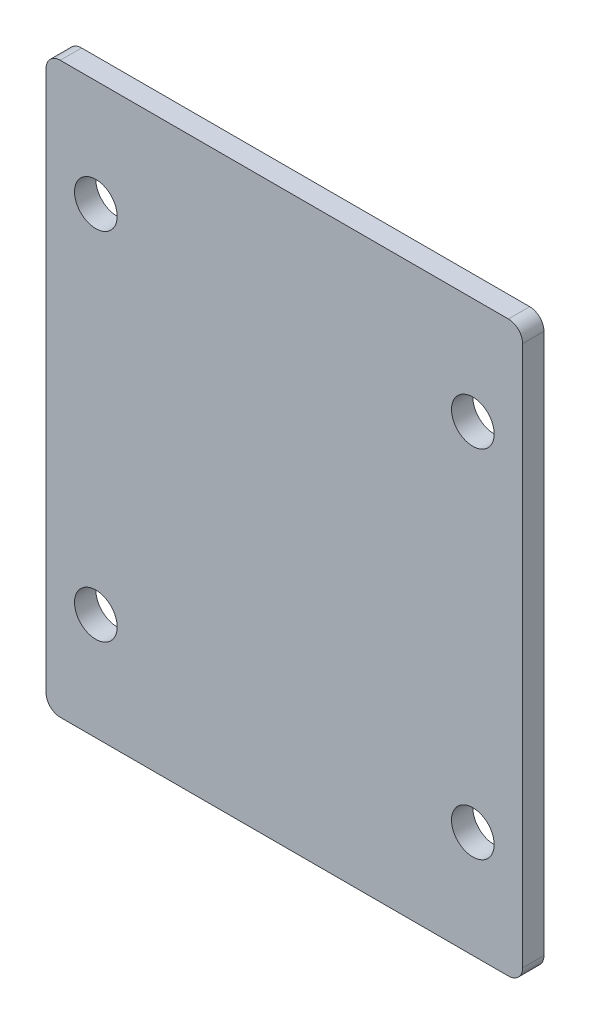
ISO-10303-21;
HEADER;
FILE_DESCRIPTION(('STEP AP214'),'2;1');
FILE_NAME('part.step','',(''),(''),'','','');
FILE_SCHEMA(('AUTOMOTIVE_DESIGN { 1 0 10303 214 1 1 1 1 }'));
ENDSEC;
DATA;
#1=APPLICATION_CONTEXT('core data for automotive mechanical design processes');
#2=APPLICATION_PROTOCOL_DEFINITION('international standard','automotive_design',2000,#1);
#3=PRODUCT_CONTEXT('',#1,'mechanical');
#4=PRODUCT('Part','Part','',(#3));
#5=PRODUCT_RELATED_PRODUCT_CATEGORY('part','',(#4));
#6=PRODUCT_DEFINITION_FORMATION('','',#4);
#7=PRODUCT_DEFINITION_CONTEXT('part definition',#1,'design');
#8=PRODUCT_DEFINITION('design','',#6,#7);
#9=PRODUCT_DEFINITION_SHAPE('','',#8);
#10=(LENGTH_UNIT() NAMED_UNIT(*) SI_UNIT(.MILLI.,.METRE.));
#11=(NAMED_UNIT(*) PLANE_ANGLE_UNIT() SI_UNIT($,.RADIAN.));
#12=(NAMED_UNIT(*) SI_UNIT($,.STERADIAN.) SOLID_ANGLE_UNIT());
#13=UNCERTAINTY_MEASURE_WITH_UNIT(LENGTH_MEASURE(1.E-05),#10,'distance_accuracy_value','');
#14=(GEOMETRIC_REPRESENTATION_CONTEXT(3) GLOBAL_UNCERTAINTY_ASSIGNED_CONTEXT((#13)) GLOBAL_UNIT_ASSIGNED_CONTEXT((#10,
#11,#12)) REPRESENTATION_CONTEXT('',''));
#15=CARTESIAN_POINT('',(0.,0.,0.));
#16=DIRECTION('',(0.,0.,1.));
#17=DIRECTION('',(1.,0.,0.));
#18=AXIS2_PLACEMENT_3D('',#15,#16,#17);
#19=CARTESIAN_POINT('',(258.579860694125,180.707229453302,-1.5));
#20=DIRECTION('',(-1.,0.,0.));
#21=DIRECTION('',(0.,0.,1.));
#22=AXIS2_PLACEMENT_3D('',#19,#20,#21);
#23=PLANE('',#22);
#24=DIRECTION('',(0.,-1.,0.));
#25=VECTOR('',#24,1.);
#26=CARTESIAN_POINT('',(258.579860694125,180.707229453302,0.));
#27=LINE('',#26,#25);
#28=CARTESIAN_POINT('',(258.579860694125,219.707229453302,0.));
#29=VERTEX_POINT('',#28);
#30=CARTESIAN_POINT('',(258.579860694125,181.707229453302,0.));
#31=VERTEX_POINT('',#30);
#32=EDGE_CURVE('E110',#29,#31,#27,.T.);
#33=ORIENTED_EDGE('',*,*,#32,.F.);
#34=DIRECTION('',(0.,0.,1.));
#35=VECTOR('',#34,1.);
#36=CARTESIAN_POINT('',(258.579860694125,219.707229453302,-1.5));
#37=LINE('',#36,#35);
#38=CARTESIAN_POINT('',(258.579860694125,219.707229453302,-1.5));
#39=VERTEX_POINT('',#38);
#40=EDGE_CURVE('E11',#29,#39,#37,.F.);
#41=ORIENTED_EDGE('',*,*,#40,.T.);
#42=DIRECTION('',(0.,-1.,0.));
#43=VECTOR('',#42,1.);
#44=CARTESIAN_POINT('',(258.579860694125,180.707229453302,-1.5));
#45=LINE('',#44,#43);
#46=CARTESIAN_POINT('',(258.579860694125,181.707229453302,-1.5));
#47=VERTEX_POINT('',#46);
#48=EDGE_CURVE('E160',#39,#47,#45,.T.);
#49=ORIENTED_EDGE('',*,*,#48,.T.);
#50=DIRECTION('',(0.,0.,1.));
#51=VECTOR('',#50,1.);
#52=CARTESIAN_POINT('',(258.579860694125,181.707229453302,-1.5));
#53=LINE('',#52,#51);
#54=EDGE_CURVE('E47',#47,#31,#53,.T.);
#55=ORIENTED_EDGE('',*,*,#54,.T.);
#56=EDGE_LOOP('',(#33,#41,#49,#55));
#57=FACE_BOUND('',#56,.T.);
#58=ADVANCED_FACE('F39',(#57),#23,.T.);
#59=CARTESIAN_POINT('',(258.579860694125,220.707229453302,-1.5));
#60=DIRECTION('',(0.,1.,0.));
#61=DIRECTION('',(0.,0.,1.));
#62=AXIS2_PLACEMENT_3D('',#59,#60,#61);
#63=PLANE('',#62);
#64=DIRECTION('',(-1.,0.,0.));
#65=VECTOR('',#64,1.);
#66=CARTESIAN_POINT('',(258.579860694125,220.707229453302,0.));
#67=LINE('',#66,#65);
#68=CARTESIAN_POINT('',(291.079860694125,220.707229453302,0.));
#69=VERTEX_POINT('',#68);
#70=CARTESIAN_POINT('',(259.579860694125,220.707229453302,0.));
#71=VERTEX_POINT('',#70);
#72=EDGE_CURVE('E135',#69,#71,#67,.T.);
#73=ORIENTED_EDGE('',*,*,#72,.F.);
#74=DIRECTION('',(0.,0.,1.));
#75=VECTOR('',#74,1.);
#76=CARTESIAN_POINT('',(291.079860694125,220.707229453302,-1.5));
#77=LINE('',#76,#75);
#78=CARTESIAN_POINT('',(291.079860694125,220.707229453302,-1.5));
#79=VERTEX_POINT('',#78);
#80=EDGE_CURVE('E61',#69,#79,#77,.F.);
#81=ORIENTED_EDGE('',*,*,#80,.T.);
#82=DIRECTION('',(-1.,0.,0.));
#83=VECTOR('',#82,1.);
#84=CARTESIAN_POINT('',(258.579860694125,220.707229453302,-1.5));
#85=LINE('',#84,#83);
#86=CARTESIAN_POINT('',(259.579860694125,220.707229453302,-1.5));
#87=VERTEX_POINT('',#86);
#88=EDGE_CURVE('E129',#79,#87,#85,.T.);
#89=ORIENTED_EDGE('',*,*,#88,.T.);
#90=DIRECTION('',(0.,0.,1.));
#91=VECTOR('',#90,1.);
#92=CARTESIAN_POINT('',(259.579860694125,220.707229453302,-1.5));
#93=LINE('',#92,#91);
#94=EDGE_CURVE('E154',#87,#71,#93,.T.);
#95=ORIENTED_EDGE('',*,*,#94,.T.);
#96=EDGE_LOOP('',(#73,#81,#89,#95));
#97=FACE_BOUND('',#96,.T.);
#98=ADVANCED_FACE('F197',(#97),#63,.T.);
#99=CARTESIAN_POINT('',(292.079860694125,180.707229453302,-1.5));
#100=DIRECTION('',(1.,0.,0.));
#101=DIRECTION('',(0.,0.,-1.));
#102=AXIS2_PLACEMENT_3D('',#99,#100,#101);
#103=PLANE('',#102);
#104=DIRECTION('',(0.,1.,0.));
#105=VECTOR('',#104,1.);
#106=CARTESIAN_POINT('',(292.079860694125,180.707229453302,0.));
#107=LINE('',#106,#105);
#108=CARTESIAN_POINT('',(292.079860694125,181.707229453302,0.));
#109=VERTEX_POINT('',#108);
#110=CARTESIAN_POINT('',(292.079860694125,219.707229453302,0.));
#111=VERTEX_POINT('',#110);
#112=EDGE_CURVE('E125',#109,#111,#107,.T.);
#113=ORIENTED_EDGE('',*,*,#112,.F.);
#114=DIRECTION('',(0.,0.,1.));
#115=VECTOR('',#114,1.);
#116=CARTESIAN_POINT('',(292.079860694125,181.707229453302,-1.5));
#117=LINE('',#116,#115);
#118=CARTESIAN_POINT('',(292.079860694125,181.707229453302,-1.5));
#119=VERTEX_POINT('',#118);
#120=EDGE_CURVE('E146',#109,#119,#117,.F.);
#121=ORIENTED_EDGE('',*,*,#120,.T.);
#122=DIRECTION('',(0.,1.,0.));
#123=VECTOR('',#122,1.);
#124=CARTESIAN_POINT('',(292.079860694125,180.707229453302,-1.5));
#125=LINE('',#124,#123);
#126=CARTESIAN_POINT('',(292.079860694125,219.707229453302,-1.5));
#127=VERTEX_POINT('',#126);
#128=EDGE_CURVE('E132',#119,#127,#125,.T.);
#129=ORIENTED_EDGE('',*,*,#128,.T.);
#130=DIRECTION('',(0.,0.,1.));
#131=VECTOR('',#130,1.);
#132=CARTESIAN_POINT('',(292.079860694125,219.707229453302,-1.5));
#133=LINE('',#132,#131);
#134=EDGE_CURVE('E143',#127,#111,#133,.T.);
#135=ORIENTED_EDGE('',*,*,#134,.T.);
#136=EDGE_LOOP('',(#113,#121,#129,#135));
#137=FACE_BOUND('',#136,.T.);
#138=ADVANCED_FACE('F176',(#137),#103,.T.);
#139=CARTESIAN_POINT('',(258.579860694125,180.707229453302,-1.5));
#140=DIRECTION('',(0.,-1.,0.));
#141=DIRECTION('',(0.,0.,-1.));
#142=AXIS2_PLACEMENT_3D('',#139,#140,#141);
#143=PLANE('',#142);
#144=DIRECTION('',(1.,0.,0.));
#145=VECTOR('',#144,1.);
#146=CARTESIAN_POINT('',(258.579860694125,180.707229453302,-1.5));
#147=LINE('',#146,#145);
#148=CARTESIAN_POINT('',(259.579860694125,180.707229453302,-1.5));
#149=VERTEX_POINT('',#148);
#150=CARTESIAN_POINT('',(291.079860694125,180.707229453302,-1.5));
#151=VERTEX_POINT('',#150);
#152=EDGE_CURVE('E161',#149,#151,#147,.T.);
#153=ORIENTED_EDGE('',*,*,#152,.T.);
#154=DIRECTION('',(0.,0.,1.));
#155=VECTOR('',#154,1.);
#156=CARTESIAN_POINT('',(291.079860694125,180.707229453302,-1.5));
#157=LINE('',#156,#155);
#158=CARTESIAN_POINT('',(291.079860694125,180.707229453302,0.));
#159=VERTEX_POINT('',#158);
#160=EDGE_CURVE('E116',#151,#159,#157,.T.);
#161=ORIENTED_EDGE('',*,*,#160,.T.);
#162=DIRECTION('',(1.,0.,0.));
#163=VECTOR('',#162,1.);
#164=CARTESIAN_POINT('',(258.579860694125,180.707229453302,0.));
#165=LINE('',#164,#163);
#166=CARTESIAN_POINT('',(259.579860694125,180.707229453302,0.));
#167=VERTEX_POINT('',#166);
#168=EDGE_CURVE('E108',#167,#159,#165,.T.);
#169=ORIENTED_EDGE('',*,*,#168,.F.);
#170=DIRECTION('',(0.,0.,1.));
#171=VECTOR('',#170,1.);
#172=CARTESIAN_POINT('',(259.579860694125,180.707229453302,-1.5));
#173=LINE('',#172,#171);
#174=EDGE_CURVE('E122',#167,#149,#173,.F.);
#175=ORIENTED_EDGE('',*,*,#174,.T.);
#176=EDGE_LOOP('',(#153,#161,#169,#175));
#177=FACE_BOUND('',#176,.T.);
#178=ADVANCED_FACE('F121',(#177),#143,.T.);
#179=CARTESIAN_POINT('',(0.,0.,-1.5));
#180=DIRECTION('',(0.,0.,-1.));
#181=DIRECTION('',(-1.,0.,0.));
#182=AXIS2_PLACEMENT_3D('',#179,#180,#181);
#183=PLANE('',#182);
#184=CARTESIAN_POINT('',(262.079860694125,188.207229453302,-1.5));
#185=DIRECTION('',(0.,0.,1.));
#186=DIRECTION('',(1.,0.,0.));
#187=AXIS2_PLACEMENT_3D('',#184,#185,#186);
#188=CIRCLE('',#187,1.50000000000002);
#189=CARTESIAN_POINT('',(263.579860694125,188.207229453302,-1.5));
#190=VERTEX_POINT('',#189);
#191=EDGE_CURVE('E233',#190,#190,#188,.T.);
#192=ORIENTED_EDGE('',*,*,#191,.T.);
#193=EDGE_LOOP('',(#192));
#194=FACE_BOUND('',#193,.T.);
#195=CARTESIAN_POINT('',(262.079860694125,213.207229453302,-1.5));
#196=DIRECTION('',(0.,0.,1.));
#197=DIRECTION('',(1.,0.,0.));
#198=AXIS2_PLACEMENT_3D('',#195,#196,#197);
#199=CIRCLE('',#198,1.50000000000002);
#200=CARTESIAN_POINT('',(263.579860694125,213.207229453302,-1.5));
#201=VERTEX_POINT('',#200);
#202=EDGE_CURVE('E241',#201,#201,#199,.T.);
#203=ORIENTED_EDGE('',*,*,#202,.T.);
#204=EDGE_LOOP('',(#203));
#205=FACE_BOUND('',#204,.T.);
#206=CARTESIAN_POINT('',(288.579860694125,188.207229453303,-1.5));
#207=DIRECTION('',(0.,0.,1.));
#208=DIRECTION('',(1.,0.,0.));
#209=AXIS2_PLACEMENT_3D('',#206,#207,#208);
#210=CIRCLE('',#209,1.50000000000002);
#211=CARTESIAN_POINT('',(290.079860694125,188.207229453303,-1.5));
#212=VERTEX_POINT('',#211);
#213=EDGE_CURVE('E247',#212,#212,#210,.T.);
#214=ORIENTED_EDGE('',*,*,#213,.T.);
#215=EDGE_LOOP('',(#214));
#216=FACE_BOUND('',#215,.T.);
#217=CARTESIAN_POINT('',(288.579860694125,213.207229453303,-1.5));
#218=DIRECTION('',(0.,0.,1.));
#219=DIRECTION('',(1.,0.,0.));
#220=AXIS2_PLACEMENT_3D('',#217,#218,#219);
#221=CIRCLE('',#220,1.50000000000002);
#222=CARTESIAN_POINT('',(290.079860694125,213.207229453303,-1.5));
#223=VERTEX_POINT('',#222);
#224=EDGE_CURVE('E171',#223,#223,#221,.T.);
#225=ORIENTED_EDGE('',*,*,#224,.T.);
#226=EDGE_LOOP('',(#225));
#227=FACE_BOUND('',#226,.T.);
#228=ORIENTED_EDGE('',*,*,#128,.F.);
#229=CARTESIAN_POINT('',(291.079860694125,181.707229453302,-1.5));
#230=DIRECTION('',(0.,0.,-1.));
#231=DIRECTION('',(-1.,0.,0.));
#232=AXIS2_PLACEMENT_3D('',#229,#230,#231);
#233=CIRCLE('',#232,1.);
#234=EDGE_CURVE('E152',#119,#151,#233,.T.);
#235=ORIENTED_EDGE('',*,*,#234,.T.);
#236=ORIENTED_EDGE('',*,*,#152,.F.);
#237=CARTESIAN_POINT('',(259.579860694125,181.707229453302,-1.5));
#238=DIRECTION('',(0.,0.,-1.));
#239=DIRECTION('',(-1.,0.,0.));
#240=AXIS2_PLACEMENT_3D('',#237,#238,#239);
#241=CIRCLE('',#240,1.);
#242=EDGE_CURVE('E128',#149,#47,#241,.T.);
#243=ORIENTED_EDGE('',*,*,#242,.T.);
#244=ORIENTED_EDGE('',*,*,#48,.F.);
#245=CARTESIAN_POINT('',(259.579860694125,219.707229453302,-1.5));
#246=DIRECTION('',(0.,0.,-1.));
#247=DIRECTION('',(-1.,0.,0.));
#248=AXIS2_PLACEMENT_3D('',#245,#246,#247);
#249=CIRCLE('',#248,1.);
#250=EDGE_CURVE('E54',#39,#87,#249,.T.);
#251=ORIENTED_EDGE('',*,*,#250,.T.);
#252=ORIENTED_EDGE('',*,*,#88,.F.);
#253=CARTESIAN_POINT('',(291.079860694125,219.707229453302,-1.5));
#254=DIRECTION('',(0.,0.,-1.));
#255=DIRECTION('',(-1.,0.,0.));
#256=AXIS2_PLACEMENT_3D('',#253,#254,#255);
#257=CIRCLE('',#256,1.);
#258=EDGE_CURVE('E150',#79,#127,#257,.T.);
#259=ORIENTED_EDGE('',*,*,#258,.T.);
#260=EDGE_LOOP('',(#228,#235,#236,#243,#244,#251,#252,#259));
#261=FACE_BOUND('',#260,.T.);
#262=ADVANCED_FACE('F182',(#194,#205,#216,#227,#261),#183,.T.);
#263=CARTESIAN_POINT('',(0.,0.,0.));
#264=DIRECTION('',(0.,0.,-1.));
#265=DIRECTION('',(-1.,0.,0.));
#266=AXIS2_PLACEMENT_3D('',#263,#264,#265);
#267=PLANE('',#266);
#268=CARTESIAN_POINT('',(262.079860694125,188.207229453302,0.));
#269=DIRECTION('',(0.,0.,1.));
#270=DIRECTION('',(1.,0.,0.));
#271=AXIS2_PLACEMENT_3D('',#268,#269,#270);
#272=CIRCLE('',#271,1.50000000000002);
#273=CARTESIAN_POINT('',(263.579860694125,188.207229453302,0.));
#274=VERTEX_POINT('',#273);
#275=EDGE_CURVE('E236',#274,#274,#272,.T.);
#276=ORIENTED_EDGE('',*,*,#275,.F.);
#277=EDGE_LOOP('',(#276));
#278=FACE_BOUND('',#277,.T.);
#279=CARTESIAN_POINT('',(262.079860694125,213.207229453302,0.));
#280=DIRECTION('',(0.,0.,1.));
#281=DIRECTION('',(1.,0.,0.));
#282=AXIS2_PLACEMENT_3D('',#279,#280,#281);
#283=CIRCLE('',#282,1.50000000000002);
#284=CARTESIAN_POINT('',(263.579860694125,213.207229453302,0.));
#285=VERTEX_POINT('',#284);
#286=EDGE_CURVE('E238',#285,#285,#283,.T.);
#287=ORIENTED_EDGE('',*,*,#286,.F.);
#288=EDGE_LOOP('',(#287));
#289=FACE_BOUND('',#288,.T.);
#290=CARTESIAN_POINT('',(288.579860694125,188.207229453303,0.));
#291=DIRECTION('',(0.,0.,1.));
#292=DIRECTION('',(1.,0.,0.));
#293=AXIS2_PLACEMENT_3D('',#290,#291,#292);
#294=CIRCLE('',#293,1.50000000000002);
#295=CARTESIAN_POINT('',(290.079860694125,188.207229453303,0.));
#296=VERTEX_POINT('',#295);
#297=EDGE_CURVE('E244',#296,#296,#294,.T.);
#298=ORIENTED_EDGE('',*,*,#297,.F.);
#299=EDGE_LOOP('',(#298));
#300=FACE_BOUND('',#299,.T.);
#301=CARTESIAN_POINT('',(288.579860694125,213.207229453303,0.));
#302=DIRECTION('',(0.,0.,1.));
#303=DIRECTION('',(1.,0.,0.));
#304=AXIS2_PLACEMENT_3D('',#301,#302,#303);
#305=CIRCLE('',#304,1.50000000000002);
#306=CARTESIAN_POINT('',(290.079860694125,213.207229453303,0.));
#307=VERTEX_POINT('',#306);
#308=EDGE_CURVE('E166',#307,#307,#305,.T.);
#309=ORIENTED_EDGE('',*,*,#308,.F.);
#310=EDGE_LOOP('',(#309));
#311=FACE_BOUND('',#310,.T.);
#312=ORIENTED_EDGE('',*,*,#168,.T.);
#313=CARTESIAN_POINT('',(291.079860694125,181.707229453302,0.));
#314=DIRECTION('',(0.,0.,-1.));
#315=DIRECTION('',(-1.,0.,0.));
#316=AXIS2_PLACEMENT_3D('',#313,#314,#315);
#317=CIRCLE('',#316,1.);
#318=EDGE_CURVE('E141',#159,#109,#317,.F.);
#319=ORIENTED_EDGE('',*,*,#318,.T.);
#320=ORIENTED_EDGE('',*,*,#112,.T.);
#321=CARTESIAN_POINT('',(291.079860694125,219.707229453302,0.));
#322=DIRECTION('',(0.,0.,-1.));
#323=DIRECTION('',(-1.,0.,0.));
#324=AXIS2_PLACEMENT_3D('',#321,#322,#323);
#325=CIRCLE('',#324,1.);
#326=EDGE_CURVE('E139',#111,#69,#325,.F.);
#327=ORIENTED_EDGE('',*,*,#326,.T.);
#328=ORIENTED_EDGE('',*,*,#72,.T.);
#329=CARTESIAN_POINT('',(259.579860694125,219.707229453302,0.));
#330=DIRECTION('',(0.,0.,-1.));
#331=DIRECTION('',(-1.,0.,0.));
#332=AXIS2_PLACEMENT_3D('',#329,#330,#331);
#333=CIRCLE('',#332,1.);
#334=EDGE_CURVE('E115',#71,#29,#333,.F.);
#335=ORIENTED_EDGE('',*,*,#334,.T.);
#336=ORIENTED_EDGE('',*,*,#32,.T.);
#337=CARTESIAN_POINT('',(259.579860694125,181.707229453302,0.));
#338=DIRECTION('',(0.,0.,-1.));
#339=DIRECTION('',(-1.,0.,0.));
#340=AXIS2_PLACEMENT_3D('',#337,#338,#339);
#341=CIRCLE('',#340,1.);
#342=EDGE_CURVE('E105',#31,#167,#341,.F.);
#343=ORIENTED_EDGE('',*,*,#342,.T.);
#344=EDGE_LOOP('',(#312,#319,#320,#327,#328,#335,#336,#343));
#345=FACE_BOUND('',#344,.T.);
#346=ADVANCED_FACE('F107',(#278,#289,#300,#311,#345),#267,.F.);
#347=CARTESIAN_POINT('',(288.579860694125,213.207229453303,-1.5));
#348=DIRECTION('',(0.,0.,1.));
#349=DIRECTION('',(1.,0.,0.));
#350=AXIS2_PLACEMENT_3D('',#347,#348,#349);
#351=CYLINDRICAL_SURFACE('',#350,1.50000000000002);
#352=ORIENTED_EDGE('',*,*,#224,.F.);
#353=EDGE_LOOP('',(#352));
#354=FACE_BOUND('',#353,.T.);
#355=ORIENTED_EDGE('',*,*,#308,.T.);
#356=EDGE_LOOP('',(#355));
#357=FACE_BOUND('',#356,.T.);
#358=ADVANCED_FACE('F210',(#354,#357),#351,.F.);
#359=CARTESIAN_POINT('',(288.579860694125,188.207229453303,-1.5));
#360=DIRECTION('',(0.,0.,1.));
#361=DIRECTION('',(1.,0.,0.));
#362=AXIS2_PLACEMENT_3D('',#359,#360,#361);
#363=CYLINDRICAL_SURFACE('',#362,1.50000000000002);
#364=ORIENTED_EDGE('',*,*,#213,.F.);
#365=EDGE_LOOP('',(#364));
#366=FACE_BOUND('',#365,.T.);
#367=ORIENTED_EDGE('',*,*,#297,.T.);
#368=EDGE_LOOP('',(#367));
#369=FACE_BOUND('',#368,.T.);
#370=ADVANCED_FACE('F217',(#366,#369),#363,.F.);
#371=CARTESIAN_POINT('',(262.079860694125,213.207229453302,-1.5));
#372=DIRECTION('',(0.,0.,1.));
#373=DIRECTION('',(1.,0.,0.));
#374=AXIS2_PLACEMENT_3D('',#371,#372,#373);
#375=CYLINDRICAL_SURFACE('',#374,1.50000000000002);
#376=ORIENTED_EDGE('',*,*,#202,.F.);
#377=EDGE_LOOP('',(#376));
#378=FACE_BOUND('',#377,.T.);
#379=ORIENTED_EDGE('',*,*,#286,.T.);
#380=EDGE_LOOP('',(#379));
#381=FACE_BOUND('',#380,.T.);
#382=ADVANCED_FACE('F221',(#378,#381),#375,.F.);
#383=CARTESIAN_POINT('',(262.079860694125,188.207229453302,-1.5));
#384=DIRECTION('',(0.,0.,1.));
#385=DIRECTION('',(1.,0.,0.));
#386=AXIS2_PLACEMENT_3D('',#383,#384,#385);
#387=CYLINDRICAL_SURFACE('',#386,1.50000000000002);
#388=ORIENTED_EDGE('',*,*,#191,.F.);
#389=EDGE_LOOP('',(#388));
#390=FACE_BOUND('',#389,.T.);
#391=ORIENTED_EDGE('',*,*,#275,.T.);
#392=EDGE_LOOP('',(#391));
#393=FACE_BOUND('',#392,.T.);
#394=ADVANCED_FACE('F194',(#390,#393),#387,.F.);
#395=CARTESIAN_POINT('',(291.079860694125,181.707229453302,-1.5));
#396=DIRECTION('',(0.,0.,1.));
#397=DIRECTION('',(1.,0.,0.));
#398=AXIS2_PLACEMENT_3D('',#395,#396,#397);
#399=CYLINDRICAL_SURFACE('',#398,1.);
#400=ORIENTED_EDGE('',*,*,#234,.F.);
#401=ORIENTED_EDGE('',*,*,#120,.F.);
#402=ORIENTED_EDGE('',*,*,#318,.F.);
#403=ORIENTED_EDGE('',*,*,#160,.F.);
#404=EDGE_LOOP('',(#400,#401,#402,#403));
#405=FACE_BOUND('',#404,.T.);
#406=ADVANCED_FACE('F181',(#405),#399,.T.);
#407=CARTESIAN_POINT('',(291.079860694125,219.707229453302,-1.5));
#408=DIRECTION('',(0.,0.,1.));
#409=DIRECTION('',(1.,0.,0.));
#410=AXIS2_PLACEMENT_3D('',#407,#408,#409);
#411=CYLINDRICAL_SURFACE('',#410,1.);
#412=ORIENTED_EDGE('',*,*,#258,.F.);
#413=ORIENTED_EDGE('',*,*,#80,.F.);
#414=ORIENTED_EDGE('',*,*,#326,.F.);
#415=ORIENTED_EDGE('',*,*,#134,.F.);
#416=EDGE_LOOP('',(#412,#413,#414,#415));
#417=FACE_BOUND('',#416,.T.);
#418=ADVANCED_FACE('F185',(#417),#411,.T.);
#419=CARTESIAN_POINT('',(259.579860694125,219.707229453302,-1.5));
#420=DIRECTION('',(0.,0.,1.));
#421=DIRECTION('',(1.,0.,0.));
#422=AXIS2_PLACEMENT_3D('',#419,#420,#421);
#423=CYLINDRICAL_SURFACE('',#422,1.);
#424=ORIENTED_EDGE('',*,*,#250,.F.);
#425=ORIENTED_EDGE('',*,*,#40,.F.);
#426=ORIENTED_EDGE('',*,*,#334,.F.);
#427=ORIENTED_EDGE('',*,*,#94,.F.);
#428=EDGE_LOOP('',(#424,#425,#426,#427));
#429=FACE_BOUND('',#428,.T.);
#430=ADVANCED_FACE('F187',(#429),#423,.T.);
#431=CARTESIAN_POINT('',(259.579860694125,181.707229453302,-1.5));
#432=DIRECTION('',(0.,0.,1.));
#433=DIRECTION('',(1.,0.,0.));
#434=AXIS2_PLACEMENT_3D('',#431,#432,#433);
#435=CYLINDRICAL_SURFACE('',#434,1.);
#436=ORIENTED_EDGE('',*,*,#242,.F.);
#437=ORIENTED_EDGE('',*,*,#174,.F.);
#438=ORIENTED_EDGE('',*,*,#342,.F.);
#439=ORIENTED_EDGE('',*,*,#54,.F.);
#440=EDGE_LOOP('',(#436,#437,#438,#439));
#441=FACE_BOUND('',#440,.T.);
#442=ADVANCED_FACE('F41',(#441),#435,.T.);
#443=CLOSED_SHELL('',(#58,#98,#138,#178,#262,#346,#358,#370,#382,#394,#406,#418,#430,#442));
#444=MANIFOLD_SOLID_BREP('B2',#443);
#445=ADVANCED_BREP_SHAPE_REPRESENTATION('',(#18,#444),#14);
#446=SHAPE_DEFINITION_REPRESENTATION(#9,#445);
ENDSEC;
END-ISO-10303-21;
